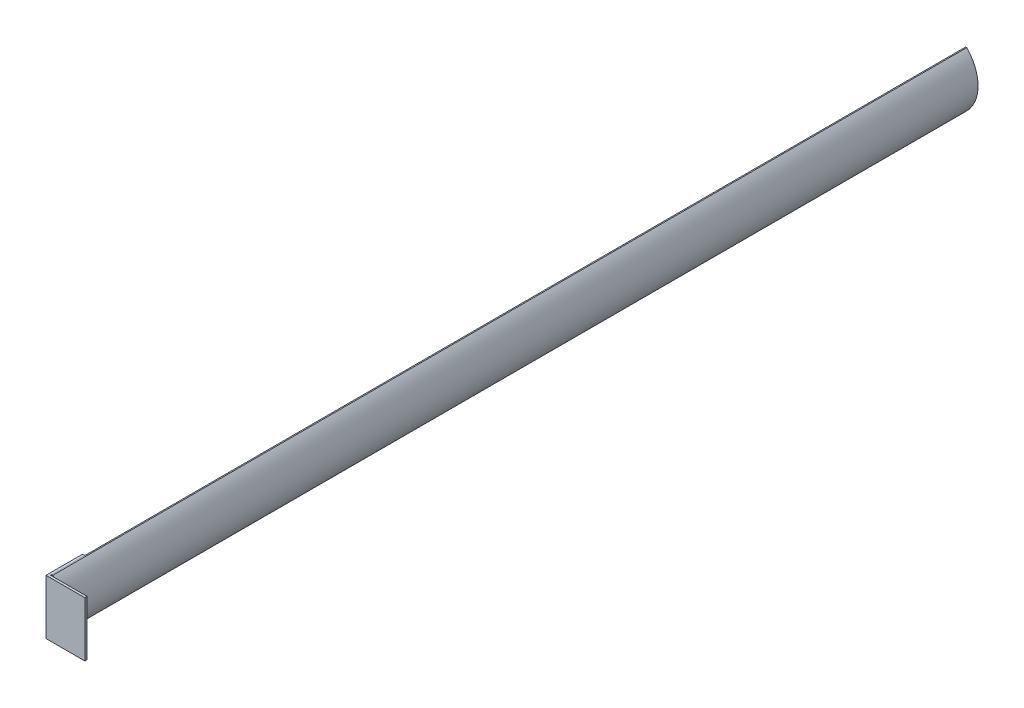
ISO-10303-21;
HEADER;
FILE_DESCRIPTION(('STEP AP214'),'2;1');
FILE_NAME('part.step','',(''),(''),'','','');
FILE_SCHEMA(('AUTOMOTIVE_DESIGN { 1 0 10303 214 1 1 1 1 }'));
ENDSEC;
DATA;
#1=APPLICATION_CONTEXT('core data for automotive mechanical design processes');
#2=APPLICATION_PROTOCOL_DEFINITION('international standard','automotive_design',2000,#1);
#3=PRODUCT_CONTEXT('',#1,'mechanical');
#4=PRODUCT('Part','Part','',(#3));
#5=PRODUCT_RELATED_PRODUCT_CATEGORY('part','',(#4));
#6=PRODUCT_DEFINITION_FORMATION('','',#4);
#7=PRODUCT_DEFINITION_CONTEXT('part definition',#1,'design');
#8=PRODUCT_DEFINITION('design','',#6,#7);
#9=PRODUCT_DEFINITION_SHAPE('','',#8);
#10=(LENGTH_UNIT() NAMED_UNIT(*) SI_UNIT(.MILLI.,.METRE.));
#11=(NAMED_UNIT(*) PLANE_ANGLE_UNIT() SI_UNIT($,.RADIAN.));
#12=(NAMED_UNIT(*) SI_UNIT($,.STERADIAN.) SOLID_ANGLE_UNIT());
#13=UNCERTAINTY_MEASURE_WITH_UNIT(LENGTH_MEASURE(1.E-05),#10,'distance_accuracy_value','');
#14=(GEOMETRIC_REPRESENTATION_CONTEXT(3) GLOBAL_UNCERTAINTY_ASSIGNED_CONTEXT((#13)) GLOBAL_UNIT_ASSIGNED_CONTEXT((#10,
#11,#12)) REPRESENTATION_CONTEXT('',''));
#15=CARTESIAN_POINT('',(0.,0.,0.));
#16=DIRECTION('',(0.,0.,1.));
#17=DIRECTION('',(1.,0.,0.));
#18=AXIS2_PLACEMENT_3D('',#15,#16,#17);
#19=CARTESIAN_POINT('',(-1.49999999999999,-47.3452350598575,385.5));
#20=DIRECTION('',(-1.,0.,0.));
#21=DIRECTION('',(0.,0.,1.));
#22=AXIS2_PLACEMENT_3D('',#19,#20,#21);
#23=PLANE('',#22);
#24=DIRECTION('',(0.,0.,-1.));
#25=VECTOR('',#24,1.);
#26=CARTESIAN_POINT('',(-1.5,-24.,385.5));
#27=LINE('',#26,#25);
#28=CARTESIAN_POINT('',(-1.5,-24.,401.5));
#29=VERTEX_POINT('',#28);
#30=CARTESIAN_POINT('',(-1.5,-24.,385.5));
#31=VERTEX_POINT('',#30);
#32=EDGE_CURVE('E54',#29,#31,#27,.T.);
#33=ORIENTED_EDGE('',*,*,#32,.F.);
#34=DIRECTION('',(0.,1.,0.));
#35=VECTOR('',#34,1.);
#36=CARTESIAN_POINT('',(-1.49999999999999,-47.3452350598575,401.5));
#37=LINE('',#36,#35);
#38=CARTESIAN_POINT('',(-1.5,0.,401.5));
#39=VERTEX_POINT('',#38);
#40=EDGE_CURVE('E93',#29,#39,#37,.T.);
#41=ORIENTED_EDGE('',*,*,#40,.T.);
#42=DIRECTION('',(0.,0.,1.));
#43=VECTOR('',#42,1.);
#44=CARTESIAN_POINT('',(-1.5,0.,385.5));
#45=LINE('',#44,#43);
#46=CARTESIAN_POINT('',(-1.5,0.,385.5));
#47=VERTEX_POINT('',#46);
#48=EDGE_CURVE('E97',#47,#39,#45,.T.);
#49=ORIENTED_EDGE('',*,*,#48,.F.);
#50=DIRECTION('',(0.,1.,0.));
#51=VECTOR('',#50,1.);
#52=CARTESIAN_POINT('',(-1.49999999999999,-47.3452350598575,385.5));
#53=LINE('',#52,#51);
#54=EDGE_CURVE('E127',#31,#47,#53,.T.);
#55=ORIENTED_EDGE('',*,*,#54,.F.);
#56=EDGE_LOOP('',(#33,#41,#49,#55));
#57=FACE_BOUND('',#56,.T.);
#58=ADVANCED_FACE('F46',(#57),#23,.T.);
#59=CARTESIAN_POINT('',(-1.49999999999999,-47.3452350598575,385.5));
#60=DIRECTION('',(0.,0.,-1.));
#61=DIRECTION('',(-1.,0.,0.));
#62=AXIS2_PLACEMENT_3D('',#59,#60,#61);
#63=PLANE('',#62);
#64=DIRECTION('',(1.,0.,0.));
#65=VECTOR('',#64,1.);
#66=CARTESIAN_POINT('',(-1.49999999999999,-24.,385.5));
#67=LINE('',#66,#65);
#68=CARTESIAN_POINT('',(-0.499999999999997,-24.,385.5));
#69=VERTEX_POINT('',#68);
#70=EDGE_CURVE('E149',#31,#69,#67,.T.);
#71=ORIENTED_EDGE('',*,*,#70,.F.);
#72=ORIENTED_EDGE('',*,*,#54,.T.);
#73=DIRECTION('',(-1.,0.,0.));
#74=VECTOR('',#73,1.);
#75=CARTESIAN_POINT('',(-1.5,0.,385.5));
#76=LINE('',#75,#74);
#77=CARTESIAN_POINT('',(-0.5,0.,385.5));
#78=VERTEX_POINT('',#77);
#79=EDGE_CURVE('E103',#78,#47,#76,.T.);
#80=ORIENTED_EDGE('',*,*,#79,.F.);
#81=DIRECTION('',(0.,1.,0.));
#82=VECTOR('',#81,1.);
#83=CARTESIAN_POINT('',(-0.499999999999994,-47.3452350598575,385.5));
#84=LINE('',#83,#82);
#85=EDGE_CURVE('E130',#69,#78,#84,.T.);
#86=ORIENTED_EDGE('',*,*,#85,.F.);
#87=EDGE_LOOP('',(#71,#72,#80,#86));
#88=FACE_BOUND('',#87,.T.);
#89=ADVANCED_FACE('F148',(#88),#63,.T.);
#90=CARTESIAN_POINT('',(-0.499999999999994,-47.3452350598575,385.5));
#91=DIRECTION('',(1.,0.,0.));
#92=DIRECTION('',(0.,0.,-1.));
#93=AXIS2_PLACEMENT_3D('',#90,#91,#92);
#94=PLANE('',#93);
#95=DIRECTION('',(0.,0.,1.));
#96=VECTOR('',#95,1.);
#97=CARTESIAN_POINT('',(-0.499999999999997,-24.,385.5));
#98=LINE('',#97,#96);
#99=CARTESIAN_POINT('',(-0.499999999999998,-24.,400.5));
#100=VERTEX_POINT('',#99);
#101=EDGE_CURVE('E152',#69,#100,#98,.T.);
#102=ORIENTED_EDGE('',*,*,#101,.F.);
#103=ORIENTED_EDGE('',*,*,#85,.T.);
#104=DIRECTION('',(0.,0.,-1.));
#105=VECTOR('',#104,1.);
#106=CARTESIAN_POINT('',(-0.5,0.,385.5));
#107=LINE('',#106,#105);
#108=CARTESIAN_POINT('',(-0.499999999999998,0.,400.5));
#109=VERTEX_POINT('',#108);
#110=EDGE_CURVE('E124',#109,#78,#107,.T.);
#111=ORIENTED_EDGE('',*,*,#110,.F.);
#112=DIRECTION('',(0.,1.,0.));
#113=VECTOR('',#112,1.);
#114=CARTESIAN_POINT('',(-0.499999999999992,-47.3452350598575,400.5));
#115=LINE('',#114,#113);
#116=EDGE_CURVE('E132',#100,#109,#115,.T.);
#117=ORIENTED_EDGE('',*,*,#116,.F.);
#118=EDGE_LOOP('',(#102,#103,#111,#117));
#119=FACE_BOUND('',#118,.T.);
#120=ADVANCED_FACE('F156',(#119),#94,.T.);
#121=CARTESIAN_POINT('',(-0.499999999999992,-47.3452350598575,400.5));
#122=DIRECTION('',(0.,0.,-1.));
#123=DIRECTION('',(-1.,0.,0.));
#124=AXIS2_PLACEMENT_3D('',#121,#122,#123);
#125=PLANE('',#124);
#126=DIRECTION('',(1.,0.,0.));
#127=VECTOR('',#126,1.);
#128=CARTESIAN_POINT('',(-0.499999999999992,-24.,400.5));
#129=LINE('',#128,#127);
#130=CARTESIAN_POINT('',(15.5,-24.,400.5));
#131=VERTEX_POINT('',#130);
#132=EDGE_CURVE('E61',#100,#131,#129,.T.);
#133=ORIENTED_EDGE('',*,*,#132,.F.);
#134=ORIENTED_EDGE('',*,*,#116,.T.);
#135=DIRECTION('',(-1.,0.,0.));
#136=VECTOR('',#135,1.);
#137=CARTESIAN_POINT('',(-0.499999999999998,0.,400.5));
#138=LINE('',#137,#136);
#139=CARTESIAN_POINT('',(15.5,0.,400.5));
#140=VERTEX_POINT('',#139);
#141=EDGE_CURVE('E121',#140,#109,#138,.T.);
#142=ORIENTED_EDGE('',*,*,#141,.F.);
#143=DIRECTION('',(0.,1.,0.));
#144=VECTOR('',#143,1.);
#145=CARTESIAN_POINT('',(15.5,-47.3452350598575,400.5));
#146=LINE('',#145,#144);
#147=EDGE_CURVE('E134',#131,#140,#146,.T.);
#148=ORIENTED_EDGE('',*,*,#147,.F.);
#149=EDGE_LOOP('',(#133,#134,#142,#148));
#150=FACE_BOUND('',#149,.T.);
#151=ADVANCED_FACE('F141',(#150),#125,.T.);
#152=CARTESIAN_POINT('',(15.5,-47.3452350598575,400.5));
#153=DIRECTION('',(1.,0.,0.));
#154=DIRECTION('',(0.,1.,0.));
#155=AXIS2_PLACEMENT_3D('',#152,#153,#154);
#156=PLANE('',#155);
#157=DIRECTION('',(0.,0.,1.));
#158=VECTOR('',#157,1.);
#159=CARTESIAN_POINT('',(15.5,-24.,400.5));
#160=LINE('',#159,#158);
#161=CARTESIAN_POINT('',(15.5,-24.,401.5));
#162=VERTEX_POINT('',#161);
#163=EDGE_CURVE('E129',#131,#162,#160,.T.);
#164=ORIENTED_EDGE('',*,*,#163,.F.);
#165=ORIENTED_EDGE('',*,*,#147,.T.);
#166=DIRECTION('',(0.,0.,-1.));
#167=VECTOR('',#166,1.);
#168=CARTESIAN_POINT('',(15.5,0.,400.5));
#169=LINE('',#168,#167);
#170=CARTESIAN_POINT('',(15.5,0.,401.5));
#171=VERTEX_POINT('',#170);
#172=EDGE_CURVE('E111',#171,#140,#169,.T.);
#173=ORIENTED_EDGE('',*,*,#172,.F.);
#174=DIRECTION('',(0.,1.,0.));
#175=VECTOR('',#174,1.);
#176=CARTESIAN_POINT('',(15.5,-47.3452350598575,401.5));
#177=LINE('',#176,#175);
#178=EDGE_CURVE('E102',#162,#171,#177,.T.);
#179=ORIENTED_EDGE('',*,*,#178,.F.);
#180=EDGE_LOOP('',(#164,#165,#173,#179));
#181=FACE_BOUND('',#180,.T.);
#182=ADVANCED_FACE('F139',(#181),#156,.T.);
#183=CARTESIAN_POINT('',(15.5,-47.3452350598575,401.5));
#184=DIRECTION('',(0.,0.,1.));
#185=DIRECTION('',(1.,0.,0.));
#186=AXIS2_PLACEMENT_3D('',#183,#184,#185);
#187=PLANE('',#186);
#188=DIRECTION('',(-1.,0.,0.));
#189=VECTOR('',#188,1.);
#190=CARTESIAN_POINT('',(15.5,-24.,401.5));
#191=LINE('',#190,#189);
#192=EDGE_CURVE('E12',#162,#29,#191,.T.);
#193=ORIENTED_EDGE('',*,*,#192,.F.);
#194=ORIENTED_EDGE('',*,*,#178,.T.);
#195=DIRECTION('',(1.,0.,0.));
#196=VECTOR('',#195,1.);
#197=CARTESIAN_POINT('',(15.5,0.,401.5));
#198=LINE('',#197,#196);
#199=EDGE_CURVE('E105',#39,#171,#198,.T.);
#200=ORIENTED_EDGE('',*,*,#199,.F.);
#201=ORIENTED_EDGE('',*,*,#40,.F.);
#202=EDGE_LOOP('',(#193,#194,#200,#201));
#203=FACE_BOUND('',#202,.T.);
#204=ADVANCED_FACE('F106',(#203),#187,.T.);
#205=CARTESIAN_POINT('',(0.,0.,0.));
#206=DIRECTION('',(0.,-1.,0.));
#207=DIRECTION('',(1.,0.,0.));
#208=AXIS2_PLACEMENT_3D('',#205,#206,#207);
#209=PLANE('',#208);
#210=ORIENTED_EDGE('',*,*,#48,.T.);
#211=ORIENTED_EDGE('',*,*,#199,.T.);
#212=ORIENTED_EDGE('',*,*,#172,.T.);
#213=ORIENTED_EDGE('',*,*,#141,.T.);
#214=ORIENTED_EDGE('',*,*,#110,.T.);
#215=ORIENTED_EDGE('',*,*,#79,.T.);
#216=EDGE_LOOP('',(#210,#211,#212,#213,#214,#215));
#217=FACE_BOUND('',#216,.T.);
#218=ADVANCED_FACE('F113',(#217),#209,.F.);
#219=CARTESIAN_POINT('',(0.,-24.,400.));
#220=DIRECTION('',(0.,1.,0.));
#221=DIRECTION('',(0.,0.,1.));
#222=AXIS2_PLACEMENT_3D('',#219,#220,#221);
#223=PLANE('',#222);
#224=ORIENTED_EDGE('',*,*,#32,.T.);
#225=ORIENTED_EDGE('',*,*,#70,.T.);
#226=ORIENTED_EDGE('',*,*,#101,.T.);
#227=ORIENTED_EDGE('',*,*,#132,.T.);
#228=ORIENTED_EDGE('',*,*,#163,.T.);
#229=ORIENTED_EDGE('',*,*,#192,.T.);
#230=EDGE_LOOP('',(#224,#225,#226,#227,#228,#229));
#231=FACE_BOUND('',#230,.T.);
#232=ADVANCED_FACE('F150',(#231),#223,.F.);
#233=CLOSED_SHELL('',(#58,#89,#120,#151,#182,#204,#218,#232));
#234=MANIFOLD_SOLID_BREP('B2',#233);
#235=CARTESIAN_POINT('',(-12.,-12.,400.));
#236=DIRECTION('',(0.,0.,-1.));
#237=DIRECTION('',(-1.,0.,0.));
#238=AXIS2_PLACEMENT_3D('',#235,#236,#237);
#239=CYLINDRICAL_SURFACE('',#238,16.9705627484772);
#240=CARTESIAN_POINT('',(-12.,-12.,0.));
#241=DIRECTION('',(0.,0.,1.));
#242=DIRECTION('',(1.,0.,0.));
#243=AXIS2_PLACEMENT_3D('',#240,#241,#242);
#244=CIRCLE('',#243,16.9705627484772);
#245=CARTESIAN_POINT('',(0.,-24.,0.));
#246=VERTEX_POINT('',#245);
#247=CARTESIAN_POINT('',(0.,0.,0.));
#248=VERTEX_POINT('',#247);
#249=EDGE_CURVE('E284',#246,#248,#244,.T.);
#250=ORIENTED_EDGE('',*,*,#249,.T.);
#251=DIRECTION('',(0.,0.,-1.));
#252=VECTOR('',#251,1.);
#253=CARTESIAN_POINT('',(0.,0.,400.));
#254=LINE('',#253,#252);
#255=CARTESIAN_POINT('',(0.,0.,400.));
#256=VERTEX_POINT('',#255);
#257=EDGE_CURVE('E44',#256,#248,#254,.T.);
#258=ORIENTED_EDGE('',*,*,#257,.F.);
#259=CARTESIAN_POINT('',(-12.,-12.,400.));
#260=DIRECTION('',(0.,0.,1.));
#261=DIRECTION('',(1.,0.,0.));
#262=AXIS2_PLACEMENT_3D('',#259,#260,#261);
#263=CIRCLE('',#262,16.9705627484772);
#264=CARTESIAN_POINT('',(0.,-24.,400.));
#265=VERTEX_POINT('',#264);
#266=EDGE_CURVE('E272',#265,#256,#263,.T.);
#267=ORIENTED_EDGE('',*,*,#266,.F.);
#268=DIRECTION('',(0.,0.,-1.));
#269=VECTOR('',#268,1.);
#270=CARTESIAN_POINT('',(0.,-24.,400.));
#271=LINE('',#270,#269);
#272=EDGE_CURVE('E280',#265,#246,#271,.T.);
#273=ORIENTED_EDGE('',*,*,#272,.T.);
#274=EDGE_LOOP('',(#250,#258,#267,#273));
#275=FACE_BOUND('',#274,.T.);
#276=ADVANCED_FACE('F221',(#275),#239,.T.);
#277=CARTESIAN_POINT('',(0.,0.,400.));
#278=DIRECTION('',(0.,-1.,0.));
#279=DIRECTION('',(1.,0.,0.));
#280=AXIS2_PLACEMENT_3D('',#277,#278,#279);
#281=PLANE('',#280);
#282=DIRECTION('',(-1.,0.,0.));
#283=VECTOR('',#282,1.);
#284=CARTESIAN_POINT('',(0.,0.,0.));
#285=LINE('',#284,#283);
#286=CARTESIAN_POINT('',(-0.5,0.,0.));
#287=VERTEX_POINT('',#286);
#288=EDGE_CURVE('E276',#248,#287,#285,.T.);
#289=ORIENTED_EDGE('',*,*,#288,.T.);
#290=DIRECTION('',(0.,0.,-1.));
#291=VECTOR('',#290,1.);
#292=CARTESIAN_POINT('',(-0.5,0.,400.));
#293=LINE('',#292,#291);
#294=CARTESIAN_POINT('',(-0.5,0.,400.));
#295=VERTEX_POINT('',#294);
#296=EDGE_CURVE('E229',#295,#287,#293,.T.);
#297=ORIENTED_EDGE('',*,*,#296,.F.);
#298=DIRECTION('',(-1.,0.,0.));
#299=VECTOR('',#298,1.);
#300=CARTESIAN_POINT('',(0.,0.,400.));
#301=LINE('',#300,#299);
#302=EDGE_CURVE('E267',#256,#295,#301,.T.);
#303=ORIENTED_EDGE('',*,*,#302,.F.);
#304=ORIENTED_EDGE('',*,*,#257,.T.);
#305=EDGE_LOOP('',(#289,#297,#303,#304));
#306=FACE_BOUND('',#305,.T.);
#307=ADVANCED_FACE('F275',(#306),#281,.F.);
#308=CARTESIAN_POINT('',(-12.5,-12.,400.));
#309=DIRECTION('',(0.,0.,-1.));
#310=DIRECTION('',(-1.,0.,0.));
#311=AXIS2_PLACEMENT_3D('',#308,#309,#310);
#312=CYLINDRICAL_SURFACE('',#311,16.9705627484771);
#313=CARTESIAN_POINT('',(-12.5,-12.,0.));
#314=DIRECTION('',(0.,0.,-1.));
#315=DIRECTION('',(-1.,0.,0.));
#316=AXIS2_PLACEMENT_3D('',#313,#314,#315);
#317=CIRCLE('',#316,16.9705627484771);
#318=CARTESIAN_POINT('',(-0.499999999999995,-24.,0.));
#319=VERTEX_POINT('',#318);
#320=EDGE_CURVE('E254',#287,#319,#317,.T.);
#321=ORIENTED_EDGE('',*,*,#320,.T.);
#322=DIRECTION('',(0.,0.,-1.));
#323=VECTOR('',#322,1.);
#324=CARTESIAN_POINT('',(-0.499999999999995,-24.,400.));
#325=LINE('',#324,#323);
#326=CARTESIAN_POINT('',(-0.499999999999995,-24.,400.));
#327=VERTEX_POINT('',#326);
#328=EDGE_CURVE('E277',#327,#319,#325,.T.);
#329=ORIENTED_EDGE('',*,*,#328,.F.);
#330=CARTESIAN_POINT('',(-12.5,-12.,400.));
#331=DIRECTION('',(0.,0.,-1.));
#332=DIRECTION('',(-1.,0.,0.));
#333=AXIS2_PLACEMENT_3D('',#330,#331,#332);
#334=CIRCLE('',#333,16.9705627484771);
#335=EDGE_CURVE('E270',#295,#327,#334,.T.);
#336=ORIENTED_EDGE('',*,*,#335,.F.);
#337=ORIENTED_EDGE('',*,*,#296,.T.);
#338=EDGE_LOOP('',(#321,#329,#336,#337));
#339=FACE_BOUND('',#338,.T.);
#340=ADVANCED_FACE('F278',(#339),#312,.F.);
#341=CARTESIAN_POINT('',(0.,-24.,400.));
#342=DIRECTION('',(0.,1.,0.));
#343=DIRECTION('',(0.,0.,1.));
#344=AXIS2_PLACEMENT_3D('',#341,#342,#343);
#345=PLANE('',#344);
#346=DIRECTION('',(1.,0.,0.));
#347=VECTOR('',#346,1.);
#348=CARTESIAN_POINT('',(0.,-24.,0.));
#349=LINE('',#348,#347);
#350=EDGE_CURVE('E260',#319,#246,#349,.T.);
#351=ORIENTED_EDGE('',*,*,#350,.T.);
#352=ORIENTED_EDGE('',*,*,#272,.F.);
#353=DIRECTION('',(1.,0.,0.));
#354=VECTOR('',#353,1.);
#355=CARTESIAN_POINT('',(0.,-24.,400.));
#356=LINE('',#355,#354);
#357=EDGE_CURVE('E237',#327,#265,#356,.T.);
#358=ORIENTED_EDGE('',*,*,#357,.F.);
#359=ORIENTED_EDGE('',*,*,#328,.T.);
#360=EDGE_LOOP('',(#351,#352,#358,#359));
#361=FACE_BOUND('',#360,.T.);
#362=ADVANCED_FACE('F291',(#361),#345,.F.);
#363=CARTESIAN_POINT('',(-12.,-12.,400.));
#364=DIRECTION('',(0.,0.,1.));
#365=DIRECTION('',(1.,0.,0.));
#366=AXIS2_PLACEMENT_3D('',#363,#364,#365);
#367=PLANE('',#366);
#368=ORIENTED_EDGE('',*,*,#266,.T.);
#369=ORIENTED_EDGE('',*,*,#302,.T.);
#370=ORIENTED_EDGE('',*,*,#335,.T.);
#371=ORIENTED_EDGE('',*,*,#357,.T.);
#372=EDGE_LOOP('',(#368,#369,#370,#371));
#373=FACE_BOUND('',#372,.T.);
#374=ADVANCED_FACE('F268',(#373),#367,.T.);
#375=CARTESIAN_POINT('',(-12.,-12.,0.));
#376=DIRECTION('',(0.,0.,1.));
#377=DIRECTION('',(1.,0.,0.));
#378=AXIS2_PLACEMENT_3D('',#375,#376,#377);
#379=PLANE('',#378);
#380=ORIENTED_EDGE('',*,*,#249,.F.);
#381=ORIENTED_EDGE('',*,*,#350,.F.);
#382=ORIENTED_EDGE('',*,*,#320,.F.);
#383=ORIENTED_EDGE('',*,*,#288,.F.);
#384=EDGE_LOOP('',(#380,#381,#382,#383));
#385=FACE_BOUND('',#384,.T.);
#386=ADVANCED_FACE('F294',(#385),#379,.F.);
#387=CLOSED_SHELL('',(#276,#307,#340,#362,#374,#386));
#388=MANIFOLD_SOLID_BREP('B6',#387);
#389=ADVANCED_BREP_SHAPE_REPRESENTATION('',(#18,#234,#388),#14);
#390=SHAPE_DEFINITION_REPRESENTATION(#9,#389);
ENDSEC;
END-ISO-10303-21;
